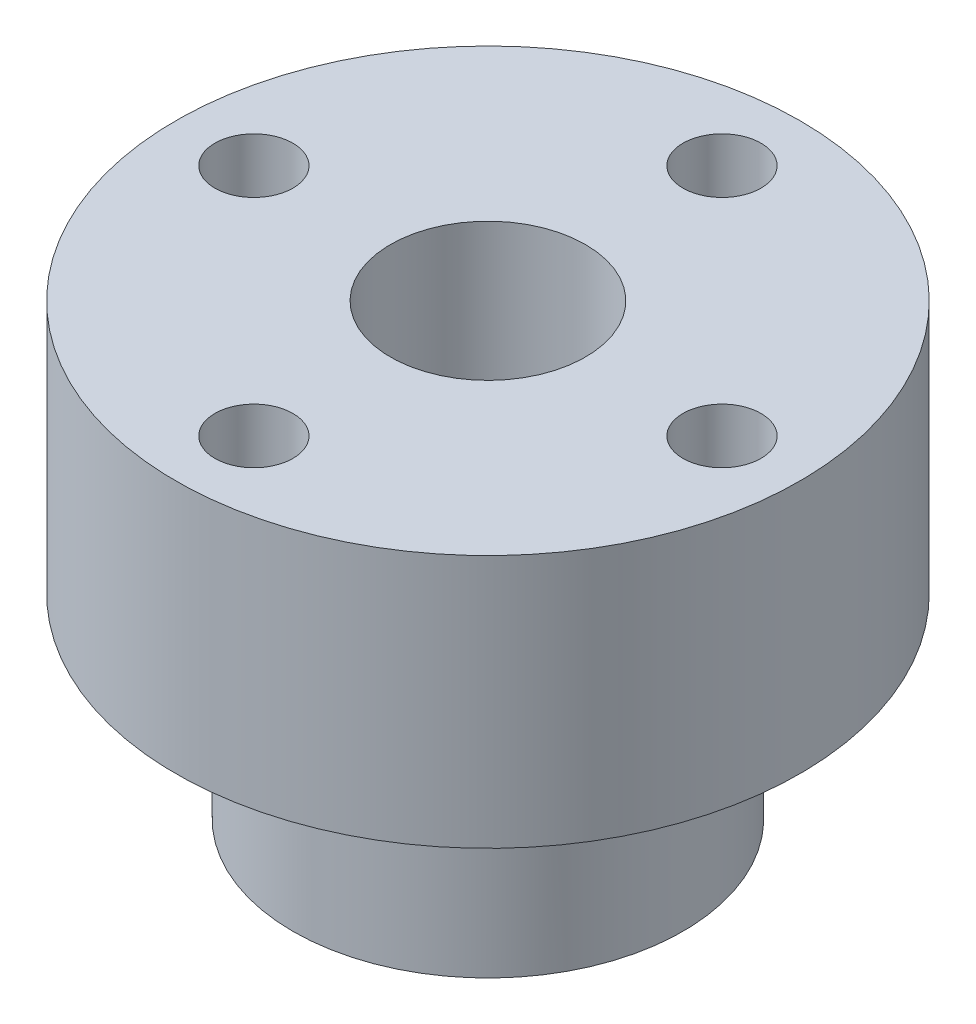
ISO-10303-21;
HEADER;
FILE_DESCRIPTION(('STEP AP214'),'2;1');
FILE_NAME('part.step','',(''),(''),'','','');
FILE_SCHEMA(('AUTOMOTIVE_DESIGN { 1 0 10303 214 1 1 1 1 }'));
ENDSEC;
DATA;
#1=APPLICATION_CONTEXT('core data for automotive mechanical design processes');
#2=APPLICATION_PROTOCOL_DEFINITION('international standard','automotive_design',2000,#1);
#3=PRODUCT_CONTEXT('',#1,'mechanical');
#4=PRODUCT('Part','Part','',(#3));
#5=PRODUCT_RELATED_PRODUCT_CATEGORY('part','',(#4));
#6=PRODUCT_DEFINITION_FORMATION('','',#4);
#7=PRODUCT_DEFINITION_CONTEXT('part definition',#1,'design');
#8=PRODUCT_DEFINITION('design','',#6,#7);
#9=PRODUCT_DEFINITION_SHAPE('','',#8);
#10=(LENGTH_UNIT() NAMED_UNIT(*) SI_UNIT(.MILLI.,.METRE.));
#11=(NAMED_UNIT(*) PLANE_ANGLE_UNIT() SI_UNIT($,.RADIAN.));
#12=(NAMED_UNIT(*) SI_UNIT($,.STERADIAN.) SOLID_ANGLE_UNIT());
#13=UNCERTAINTY_MEASURE_WITH_UNIT(LENGTH_MEASURE(1.E-05),#10,'distance_accuracy_value','');
#14=(GEOMETRIC_REPRESENTATION_CONTEXT(3) GLOBAL_UNCERTAINTY_ASSIGNED_CONTEXT((#13)) GLOBAL_UNIT_ASSIGNED_CONTEXT((#10,
#11,#12)) REPRESENTATION_CONTEXT('',''));
#15=CARTESIAN_POINT('',(0.,0.,0.));
#16=DIRECTION('',(0.,0.,1.));
#17=DIRECTION('',(1.,0.,0.));
#18=AXIS2_PLACEMENT_3D('',#15,#16,#17);
#19=CARTESIAN_POINT('',(0.,13.,0.));
#20=DIRECTION('',(0.,-1.,0.));
#21=DIRECTION('',(0.,0.,-1.));
#22=AXIS2_PLACEMENT_3D('',#19,#20,#21);
#23=CYLINDRICAL_SURFACE('',#22,16.);
#24=CARTESIAN_POINT('',(0.,13.,0.));
#25=DIRECTION('',(0.,1.,0.));
#26=DIRECTION('',(0.,0.,1.));
#27=AXIS2_PLACEMENT_3D('',#24,#25,#26);
#28=CIRCLE('',#27,16.);
#29=CARTESIAN_POINT('',(0.,13.,-16.));
#30=VERTEX_POINT('',#29);
#31=EDGE_CURVE('E87',#30,#30,#28,.T.);
#32=CARTESIAN_POINT('',(0.,0.,0.));
#33=DIRECTION('',(0.,1.,0.));
#34=DIRECTION('',(0.,0.,1.));
#35=AXIS2_PLACEMENT_3D('',#32,#33,#34);
#36=CIRCLE('',#35,16.);
#37=CARTESIAN_POINT('',(0.,0.,-16.));
#38=VERTEX_POINT('',#37);
#39=EDGE_CURVE('E45',#38,#38,#36,.T.);
#40=CARTESIAN_POINT('',(0.,13.,-16.));
#41=CARTESIAN_POINT('',(0.,12.8645833333333,-16.));
#42=CARTESIAN_POINT('',(0.,12.7291666666667,-16.));
#43=CARTESIAN_POINT('',(0.,12.4583333333333,-16.));
#44=CARTESIAN_POINT('',(0.,12.3229166666667,-16.));
#45=CARTESIAN_POINT('',(0.,12.0520833333333,-16.));
#46=CARTESIAN_POINT('',(0.,11.9166666666667,-16.));
#47=CARTESIAN_POINT('',(0.,11.6458333333333,-16.));
#48=CARTESIAN_POINT('',(0.,11.5104166666667,-16.));
#49=CARTESIAN_POINT('',(0.,11.2395833333333,-16.));
#50=CARTESIAN_POINT('',(0.,11.1041666666667,-16.));
#51=CARTESIAN_POINT('',(0.,10.8333333333333,-16.));
#52=CARTESIAN_POINT('',(0.,10.6979166666667,-16.));
#53=CARTESIAN_POINT('',(0.,10.4270833333333,-16.));
#54=CARTESIAN_POINT('',(0.,10.2916666666667,-16.));
#55=CARTESIAN_POINT('',(0.,10.0208333333333,-16.));
#56=CARTESIAN_POINT('',(0.,9.88541666666667,-16.));
#57=CARTESIAN_POINT('',(0.,9.61458333333333,-16.));
#58=CARTESIAN_POINT('',(0.,9.47916666666667,-16.));
#59=CARTESIAN_POINT('',(0.,9.20833333333333,-16.));
#60=CARTESIAN_POINT('',(0.,9.07291666666667,-16.));
#61=CARTESIAN_POINT('',(0.,8.80208333333333,-16.));
#62=CARTESIAN_POINT('',(0.,8.66666666666667,-16.));
#63=CARTESIAN_POINT('',(0.,8.39583333333333,-16.));
#64=CARTESIAN_POINT('',(0.,8.26041666666667,-16.));
#65=CARTESIAN_POINT('',(0.,7.98958333333333,-16.));
#66=CARTESIAN_POINT('',(0.,7.85416666666667,-16.));
#67=CARTESIAN_POINT('',(0.,7.58333333333333,-16.));
#68=CARTESIAN_POINT('',(0.,7.44791666666667,-16.));
#69=CARTESIAN_POINT('',(0.,7.17708333333333,-16.));
#70=CARTESIAN_POINT('',(0.,7.04166666666667,-16.));
#71=CARTESIAN_POINT('',(0.,6.77083333333333,-16.));
#72=CARTESIAN_POINT('',(0.,6.63541666666667,-16.));
#73=CARTESIAN_POINT('',(0.,6.36458333333333,-16.));
#74=CARTESIAN_POINT('',(0.,6.22916666666667,-16.));
#75=CARTESIAN_POINT('',(0.,5.95833333333333,-16.));
#76=CARTESIAN_POINT('',(0.,5.82291666666667,-16.));
#77=CARTESIAN_POINT('',(0.,5.55208333333333,-16.));
#78=CARTESIAN_POINT('',(0.,5.41666666666667,-16.));
#79=CARTESIAN_POINT('',(0.,5.14583333333333,-16.));
#80=CARTESIAN_POINT('',(0.,5.01041666666667,-16.));
#81=CARTESIAN_POINT('',(0.,4.73958333333333,-16.));
#82=CARTESIAN_POINT('',(0.,4.60416666666667,-16.));
#83=CARTESIAN_POINT('',(0.,4.33333333333333,-16.));
#84=CARTESIAN_POINT('',(0.,4.19791666666667,-16.));
#85=CARTESIAN_POINT('',(0.,3.92708333333333,-16.));
#86=CARTESIAN_POINT('',(0.,3.79166666666667,-16.));
#87=CARTESIAN_POINT('',(0.,3.52083333333333,-16.));
#88=CARTESIAN_POINT('',(0.,3.38541666666667,-16.));
#89=CARTESIAN_POINT('',(0.,3.11458333333333,-16.));
#90=CARTESIAN_POINT('',(0.,2.97916666666667,-16.));
#91=CARTESIAN_POINT('',(0.,2.70833333333333,-16.));
#92=CARTESIAN_POINT('',(0.,2.57291666666667,-16.));
#93=CARTESIAN_POINT('',(0.,2.30208333333333,-16.));
#94=CARTESIAN_POINT('',(0.,2.16666666666667,-16.));
#95=CARTESIAN_POINT('',(0.,1.89583333333333,-16.));
#96=CARTESIAN_POINT('',(0.,1.76041666666667,-16.));
#97=CARTESIAN_POINT('',(0.,1.48958333333333,-16.));
#98=CARTESIAN_POINT('',(0.,1.35416666666667,-16.));
#99=CARTESIAN_POINT('',(0.,1.08333333333333,-16.));
#100=CARTESIAN_POINT('',(0.,0.947916666666667,-16.));
#101=CARTESIAN_POINT('',(0.,0.677083333333334,-16.));
#102=CARTESIAN_POINT('',(0.,0.541666666666667,-16.));
#103=CARTESIAN_POINT('',(0.,0.270833333333334,-16.));
#104=CARTESIAN_POINT('',(0.,0.135416666666667,-16.));
#105=CARTESIAN_POINT('',(0.,0.,-16.));
#106=B_SPLINE_CURVE_WITH_KNOTS('',3,(#40,#41,#42,#43,#44,#45,#46,#47,#48,#49,#50,#51,#52,#53,
#54,#55,#56,#57,#58,#59,#60,#61,#62,#63,#64,#65,#66,#67,#68,#69,#70,#71,#72,#73,#74,#75,#76,#77,
#78,#79,#80,#81,#82,#83,#84,#85,#86,#87,#88,#89,#90,#91,#92,#93,#94,#95,#96,#97,#98,#99,#100,
#101,#102,#103,#104,#105),.UNSPECIFIED.,.F.,.F.,(4,2,2,2,2,2,2,2,2,2,2,2,2,2,2,2,2,2,2,2,2,2,2,
2,2,2,2,2,2,2,2,2,4),(0.,0.406249999999999,0.812499999999999,1.21875,1.625,2.03125,2.4375,
2.84375,3.25,3.65625,4.0625,4.46875,4.875,5.28125,5.6875,6.09375,6.5,6.90625,7.3125,7.71875,
8.125,8.53125,8.9375,9.34375,9.75,10.15625,10.5625,10.96875,11.375,11.78125,12.1875,12.59375,
13.),.UNSPECIFIED.);
#107=EDGE_CURVE('BSEAM41',#30,#38,#106,.T.);
#108=ORIENTED_EDGE('',*,*,#31,.F.);
#109=ORIENTED_EDGE('',*,*,#39,.T.);
#110=ORIENTED_EDGE('',*,*,#107,.T.);
#111=ORIENTED_EDGE('',*,*,#107,.F.);
#112=EDGE_LOOP('',(#108,#110,#109,#111));
#113=FACE_BOUND('',#112,.T.);
#114=ADVANCED_FACE('F41',(#113),#23,.T.);
#115=CARTESIAN_POINT('',(0.,13.,-12.));
#116=DIRECTION('',(0.,-1.,0.));
#117=DIRECTION('',(0.,0.,-1.));
#118=AXIS2_PLACEMENT_3D('',#115,#116,#117);
#119=CYLINDRICAL_SURFACE('',#118,2.);
#120=CARTESIAN_POINT('',(0.,13.,-12.));
#121=DIRECTION('',(0.,1.,0.));
#122=DIRECTION('',(0.,0.,1.));
#123=AXIS2_PLACEMENT_3D('',#120,#121,#122);
#124=CIRCLE('',#123,2.);
#125=CARTESIAN_POINT('',(0.,13.,-10.));
#126=VERTEX_POINT('',#125);
#127=EDGE_CURVE('E92',#126,#126,#124,.T.);
#128=ORIENTED_EDGE('',*,*,#127,.T.);
#129=EDGE_LOOP('',(#128));
#130=FACE_BOUND('',#129,.T.);
#131=CARTESIAN_POINT('',(0.,0.,-12.));
#132=DIRECTION('',(0.,1.,0.));
#133=DIRECTION('',(0.,0.,1.));
#134=AXIS2_PLACEMENT_3D('',#131,#132,#133);
#135=CIRCLE('',#134,2.);
#136=CARTESIAN_POINT('',(0.,0.,-10.));
#137=VERTEX_POINT('',#136);
#138=EDGE_CURVE('E99',#137,#137,#135,.T.);
#139=ORIENTED_EDGE('',*,*,#138,.F.);
#140=EDGE_LOOP('',(#139));
#141=FACE_BOUND('',#140,.T.);
#142=ADVANCED_FACE('F117',(#130,#141),#119,.F.);
#143=CARTESIAN_POINT('',(-12.,13.,0.));
#144=DIRECTION('',(0.,-1.,0.));
#145=DIRECTION('',(0.,0.,-1.));
#146=AXIS2_PLACEMENT_3D('',#143,#144,#145);
#147=CYLINDRICAL_SURFACE('',#146,2.);
#148=CARTESIAN_POINT('',(-12.,13.,0.));
#149=DIRECTION('',(0.,1.,0.));
#150=DIRECTION('',(0.,0.,1.));
#151=AXIS2_PLACEMENT_3D('',#148,#149,#150);
#152=CIRCLE('',#151,2.);
#153=CARTESIAN_POINT('',(-12.,13.,2.));
#154=VERTEX_POINT('',#153);
#155=EDGE_CURVE('E110',#154,#154,#152,.T.);
#156=ORIENTED_EDGE('',*,*,#155,.T.);
#157=EDGE_LOOP('',(#156));
#158=FACE_BOUND('',#157,.T.);
#159=CARTESIAN_POINT('',(-12.,0.,0.));
#160=DIRECTION('',(0.,1.,0.));
#161=DIRECTION('',(0.,0.,1.));
#162=AXIS2_PLACEMENT_3D('',#159,#160,#161);
#163=CIRCLE('',#162,2.);
#164=CARTESIAN_POINT('',(-10.,0.,0.));
#165=VERTEX_POINT('',#164);
#166=EDGE_CURVE('E98',#165,#165,#163,.T.);
#167=ORIENTED_EDGE('',*,*,#166,.F.);
#168=EDGE_LOOP('',(#167));
#169=FACE_BOUND('',#168,.T.);
#170=ADVANCED_FACE('F134',(#158,#169),#147,.F.);
#171=CARTESIAN_POINT('',(0.,13.,12.));
#172=DIRECTION('',(0.,-1.,0.));
#173=DIRECTION('',(0.,0.,-1.));
#174=AXIS2_PLACEMENT_3D('',#171,#172,#173);
#175=CYLINDRICAL_SURFACE('',#174,2.);
#176=CARTESIAN_POINT('',(0.,13.,12.));
#177=DIRECTION('',(0.,1.,0.));
#178=DIRECTION('',(0.,0.,1.));
#179=AXIS2_PLACEMENT_3D('',#176,#177,#178);
#180=CIRCLE('',#179,2.);
#181=CARTESIAN_POINT('',(0.,13.,14.));
#182=VERTEX_POINT('',#181);
#183=EDGE_CURVE('E106',#182,#182,#180,.T.);
#184=ORIENTED_EDGE('',*,*,#183,.T.);
#185=EDGE_LOOP('',(#184));
#186=FACE_BOUND('',#185,.T.);
#187=CARTESIAN_POINT('',(0.,0.,12.));
#188=DIRECTION('',(0.,1.,0.));
#189=DIRECTION('',(0.,0.,1.));
#190=AXIS2_PLACEMENT_3D('',#187,#188,#189);
#191=CIRCLE('',#190,2.);
#192=CARTESIAN_POINT('',(0.,0.,10.));
#193=VERTEX_POINT('',#192);
#194=EDGE_CURVE('E77',#193,#193,#191,.T.);
#195=ORIENTED_EDGE('',*,*,#194,.F.);
#196=EDGE_LOOP('',(#195));
#197=FACE_BOUND('',#196,.T.);
#198=ADVANCED_FACE('F140',(#186,#197),#175,.F.);
#199=CARTESIAN_POINT('',(12.,13.,0.));
#200=DIRECTION('',(0.,-1.,0.));
#201=DIRECTION('',(0.,0.,-1.));
#202=AXIS2_PLACEMENT_3D('',#199,#200,#201);
#203=CYLINDRICAL_SURFACE('',#202,2.);
#204=CARTESIAN_POINT('',(12.,13.,0.));
#205=DIRECTION('',(0.,1.,0.));
#206=DIRECTION('',(0.,0.,1.));
#207=AXIS2_PLACEMENT_3D('',#204,#205,#206);
#208=CIRCLE('',#207,2.);
#209=CARTESIAN_POINT('',(12.,13.,2.));
#210=VERTEX_POINT('',#209);
#211=EDGE_CURVE('E102',#210,#210,#208,.T.);
#212=ORIENTED_EDGE('',*,*,#211,.T.);
#213=EDGE_LOOP('',(#212));
#214=FACE_BOUND('',#213,.T.);
#215=CARTESIAN_POINT('',(12.,0.,0.));
#216=DIRECTION('',(0.,1.,0.));
#217=DIRECTION('',(0.,0.,1.));
#218=AXIS2_PLACEMENT_3D('',#215,#216,#217);
#219=CIRCLE('',#218,2.);
#220=CARTESIAN_POINT('',(10.,0.,0.));
#221=VERTEX_POINT('',#220);
#222=EDGE_CURVE('E75',#221,#221,#219,.T.);
#223=ORIENTED_EDGE('',*,*,#222,.F.);
#224=EDGE_LOOP('',(#223));
#225=FACE_BOUND('',#224,.T.);
#226=ADVANCED_FACE('F43',(#214,#225),#203,.F.);
#227=CARTESIAN_POINT('',(0.,13.,0.));
#228=DIRECTION('',(0.,-1.,0.));
#229=DIRECTION('',(0.,0.,-1.));
#230=AXIS2_PLACEMENT_3D('',#227,#228,#229);
#231=CYLINDRICAL_SURFACE('',#230,5.);
#232=CARTESIAN_POINT('',(0.,13.,0.));
#233=DIRECTION('',(0.,1.,0.));
#234=DIRECTION('',(0.,0.,1.));
#235=AXIS2_PLACEMENT_3D('',#232,#233,#234);
#236=CIRCLE('',#235,5.);
#237=CARTESIAN_POINT('',(0.,13.,-5.));
#238=VERTEX_POINT('',#237);
#239=EDGE_CURVE('E84',#238,#238,#236,.T.);
#240=CARTESIAN_POINT('',(0.,-10.,0.));
#241=DIRECTION('',(0.,1.,0.));
#242=DIRECTION('',(0.,0.,1.));
#243=AXIS2_PLACEMENT_3D('',#240,#241,#242);
#244=CIRCLE('',#243,5.);
#245=CARTESIAN_POINT('',(0.,-10.,-5.));
#246=VERTEX_POINT('',#245);
#247=EDGE_CURVE('E78',#246,#246,#244,.T.);
#248=CARTESIAN_POINT('',(0.,13.,-5.));
#249=CARTESIAN_POINT('',(0.,12.7604166666667,-5.));
#250=CARTESIAN_POINT('',(0.,12.5208333333333,-5.));
#251=CARTESIAN_POINT('',(0.,12.0416666666667,-5.));
#252=CARTESIAN_POINT('',(0.,11.8020833333333,-5.));
#253=CARTESIAN_POINT('',(0.,11.3229166666667,-5.));
#254=CARTESIAN_POINT('',(0.,11.0833333333333,-5.));
#255=CARTESIAN_POINT('',(0.,10.6041666666667,-5.));
#256=CARTESIAN_POINT('',(0.,10.3645833333333,-5.));
#257=CARTESIAN_POINT('',(0.,9.88541666666667,-5.));
#258=CARTESIAN_POINT('',(0.,9.64583333333333,-5.));
#259=CARTESIAN_POINT('',(0.,9.16666666666666,-5.));
#260=CARTESIAN_POINT('',(0.,8.92708333333333,-5.));
#261=CARTESIAN_POINT('',(0.,8.44791666666666,-5.));
#262=CARTESIAN_POINT('',(0.,8.20833333333333,-5.));
#263=CARTESIAN_POINT('',(0.,7.72916666666666,-5.));
#264=CARTESIAN_POINT('',(0.,7.48958333333333,-5.));
#265=CARTESIAN_POINT('',(0.,7.01041666666666,-5.));
#266=CARTESIAN_POINT('',(0.,6.77083333333333,-5.));
#267=CARTESIAN_POINT('',(0.,6.29166666666666,-5.));
#268=CARTESIAN_POINT('',(0.,6.05208333333333,-5.));
#269=CARTESIAN_POINT('',(0.,5.57291666666666,-5.));
#270=CARTESIAN_POINT('',(0.,5.33333333333333,-5.));
#271=CARTESIAN_POINT('',(0.,4.85416666666667,-5.));
#272=CARTESIAN_POINT('',(0.,4.61458333333333,-5.));
#273=CARTESIAN_POINT('',(0.,4.13541666666667,-5.));
#274=CARTESIAN_POINT('',(0.,3.89583333333333,-5.));
#275=CARTESIAN_POINT('',(0.,3.41666666666667,-5.));
#276=CARTESIAN_POINT('',(0.,3.17708333333333,-5.));
#277=CARTESIAN_POINT('',(0.,2.69791666666667,-5.));
#278=CARTESIAN_POINT('',(0.,2.45833333333333,-5.));
#279=CARTESIAN_POINT('',(0.,1.97916666666667,-5.));
#280=CARTESIAN_POINT('',(0.,1.73958333333333,-5.));
#281=CARTESIAN_POINT('',(0.,1.26041666666666,-5.));
#282=CARTESIAN_POINT('',(0.,1.02083333333333,-5.));
#283=CARTESIAN_POINT('',(0.,0.541666666666664,-5.));
#284=CARTESIAN_POINT('',(0.,0.30208333333333,-5.));
#285=CARTESIAN_POINT('',(0.,-0.177083333333336,-5.));
#286=CARTESIAN_POINT('',(0.,-0.416666666666669,-5.));
#287=CARTESIAN_POINT('',(0.,-0.895833333333336,-5.));
#288=CARTESIAN_POINT('',(0.,-1.13541666666667,-5.));
#289=CARTESIAN_POINT('',(0.,-1.61458333333334,-5.));
#290=CARTESIAN_POINT('',(0.,-1.85416666666667,-5.));
#291=CARTESIAN_POINT('',(0.,-2.33333333333334,-5.));
#292=CARTESIAN_POINT('',(0.,-2.57291666666667,-5.));
#293=CARTESIAN_POINT('',(0.,-3.05208333333333,-5.));
#294=CARTESIAN_POINT('',(0.,-3.29166666666667,-5.));
#295=CARTESIAN_POINT('',(0.,-3.77083333333333,-5.));
#296=CARTESIAN_POINT('',(0.,-4.01041666666667,-5.));
#297=CARTESIAN_POINT('',(0.,-4.48958333333334,-5.));
#298=CARTESIAN_POINT('',(0.,-4.72916666666667,-5.));
#299=CARTESIAN_POINT('',(0.,-5.20833333333334,-5.));
#300=CARTESIAN_POINT('',(0.,-5.44791666666667,-5.));
#301=CARTESIAN_POINT('',(0.,-5.92708333333334,-5.));
#302=CARTESIAN_POINT('',(0.,-6.16666666666667,-5.));
#303=CARTESIAN_POINT('',(0.,-6.64583333333334,-5.));
#304=CARTESIAN_POINT('',(0.,-6.88541666666667,-5.));
#305=CARTESIAN_POINT('',(0.,-7.36458333333333,-5.));
#306=CARTESIAN_POINT('',(0.,-7.60416666666667,-5.));
#307=CARTESIAN_POINT('',(0.,-8.08333333333333,-5.));
#308=CARTESIAN_POINT('',(0.,-8.32291666666667,-5.));
#309=CARTESIAN_POINT('',(0.,-8.80208333333334,-5.));
#310=CARTESIAN_POINT('',(0.,-9.04166666666667,-5.));
#311=CARTESIAN_POINT('',(0.,-9.52083333333334,-5.));
#312=CARTESIAN_POINT('',(0.,-9.76041666666667,-5.));
#313=CARTESIAN_POINT('',(0.,-10.,-5.));
#314=B_SPLINE_CURVE_WITH_KNOTS('',3,(#248,#249,#250,#251,#252,#253,#254,#255,#256,#257,#258,
#259,#260,#261,#262,#263,#264,#265,#266,#267,#268,#269,#270,#271,#272,#273,#274,#275,#276,#277,
#278,#279,#280,#281,#282,#283,#284,#285,#286,#287,#288,#289,#290,#291,#292,#293,#294,#295,#296,
#297,#298,#299,#300,#301,#302,#303,#304,#305,#306,#307,#308,#309,#310,#311,#312,#313),
.UNSPECIFIED.,.F.,.F.,(4,2,2,2,2,2,2,2,2,2,2,2,2,2,2,2,2,2,2,2,2,2,2,2,2,2,2,2,2,2,2,2,4),(0.,
0.718750000000001,1.4375,2.15625,2.875,3.59375,4.3125,5.03125,5.75,6.46875,7.1875,7.90625,8.625,
9.34375,10.0625,10.78125,11.5,12.21875,12.9375,13.65625,14.375,15.09375,15.8125,16.53125,17.25,
17.96875,18.6875,19.40625,20.125,20.84375,21.5625,22.28125,23.),.UNSPECIFIED.);
#315=EDGE_CURVE('BSEAM123',#238,#246,#314,.T.);
#316=ORIENTED_EDGE('',*,*,#239,.T.);
#317=ORIENTED_EDGE('',*,*,#247,.F.);
#318=ORIENTED_EDGE('',*,*,#315,.T.);
#319=ORIENTED_EDGE('',*,*,#315,.F.);
#320=EDGE_LOOP('',(#316,#318,#317,#319));
#321=FACE_BOUND('',#320,.T.);
#322=ADVANCED_FACE('F123',(#321),#231,.F.);
#323=CARTESIAN_POINT('',(0.,13.,0.));
#324=DIRECTION('',(0.,1.,0.));
#325=DIRECTION('',(0.,0.,1.));
#326=AXIS2_PLACEMENT_3D('',#323,#324,#325);
#327=PLANE('',#326);
#328=ORIENTED_EDGE('',*,*,#211,.F.);
#329=EDGE_LOOP('',(#328));
#330=FACE_BOUND('',#329,.T.);
#331=ORIENTED_EDGE('',*,*,#183,.F.);
#332=EDGE_LOOP('',(#331));
#333=FACE_BOUND('',#332,.T.);
#334=ORIENTED_EDGE('',*,*,#155,.F.);
#335=EDGE_LOOP('',(#334));
#336=FACE_BOUND('',#335,.T.);
#337=ORIENTED_EDGE('',*,*,#127,.F.);
#338=EDGE_LOOP('',(#337));
#339=FACE_BOUND('',#338,.T.);
#340=ORIENTED_EDGE('',*,*,#31,.T.);
#341=EDGE_LOOP('',(#340));
#342=FACE_BOUND('',#341,.T.);
#343=ORIENTED_EDGE('',*,*,#239,.F.);
#344=EDGE_LOOP('',(#343));
#345=FACE_BOUND('',#344,.T.);
#346=ADVANCED_FACE('F120',(#330,#333,#336,#339,#342,#345),#327,.T.);
#347=CARTESIAN_POINT('',(0.,0.,0.));
#348=DIRECTION('',(0.,1.,0.));
#349=DIRECTION('',(0.,0.,1.));
#350=AXIS2_PLACEMENT_3D('',#347,#348,#349);
#351=PLANE('',#350);
#352=ORIENTED_EDGE('',*,*,#194,.T.);
#353=CARTESIAN_POINT('',(0.,0.,0.));
#354=DIRECTION('',(0.,1.,0.));
#355=DIRECTION('',(0.,0.,1.));
#356=AXIS2_PLACEMENT_3D('',#353,#354,#355);
#357=CIRCLE('',#356,10.);
#358=EDGE_CURVE('E52',#193,#221,#357,.T.);
#359=ORIENTED_EDGE('',*,*,#358,.T.);
#360=ORIENTED_EDGE('',*,*,#222,.T.);
#361=EDGE_CURVE('E11',#221,#137,#357,.T.);
#362=ORIENTED_EDGE('',*,*,#361,.T.);
#363=ORIENTED_EDGE('',*,*,#138,.T.);
#364=EDGE_CURVE('E50',#137,#165,#357,.T.);
#365=ORIENTED_EDGE('',*,*,#364,.T.);
#366=ORIENTED_EDGE('',*,*,#166,.T.);
#367=EDGE_CURVE('E62',#165,#193,#357,.T.);
#368=ORIENTED_EDGE('',*,*,#367,.T.);
#369=EDGE_LOOP('',(#352,#359,#360,#362,#363,#365,#366,#368));
#370=FACE_BOUND('',#369,.T.);
#371=ORIENTED_EDGE('',*,*,#39,.F.);
#372=EDGE_LOOP('',(#371));
#373=FACE_BOUND('',#372,.T.);
#374=ADVANCED_FACE('F72',(#370,#373),#351,.F.);
#375=CARTESIAN_POINT('',(0.,-10.,0.));
#376=DIRECTION('',(0.,1.,0.));
#377=DIRECTION('',(0.,0.,1.));
#378=AXIS2_PLACEMENT_3D('',#375,#376,#377);
#379=CYLINDRICAL_SURFACE('',#378,10.);
#380=CARTESIAN_POINT('',(0.,-10.,0.));
#381=DIRECTION('',(0.,1.,0.));
#382=DIRECTION('',(0.,0.,1.));
#383=AXIS2_PLACEMENT_3D('',#380,#381,#382);
#384=CIRCLE('',#383,10.);
#385=CARTESIAN_POINT('',(0.,-10.,10.));
#386=VERTEX_POINT('',#385);
#387=EDGE_CURVE('E80',#386,#386,#384,.T.);
#388=ORIENTED_EDGE('',*,*,#387,.T.);
#389=EDGE_LOOP('',(#388));
#390=FACE_BOUND('',#389,.T.);
#391=ORIENTED_EDGE('',*,*,#358,.F.);
#392=ORIENTED_EDGE('',*,*,#367,.F.);
#393=ORIENTED_EDGE('',*,*,#364,.F.);
#394=ORIENTED_EDGE('',*,*,#361,.F.);
#395=EDGE_LOOP('',(#391,#392,#393,#394));
#396=FACE_BOUND('',#395,.T.);
#397=ADVANCED_FACE('F67',(#390,#396),#379,.T.);
#398=CARTESIAN_POINT('',(0.,-10.,0.));
#399=DIRECTION('',(0.,1.,0.));
#400=DIRECTION('',(0.,0.,1.));
#401=AXIS2_PLACEMENT_3D('',#398,#399,#400);
#402=PLANE('',#401);
#403=ORIENTED_EDGE('',*,*,#247,.T.);
#404=EDGE_LOOP('',(#403));
#405=FACE_BOUND('',#404,.T.);
#406=ORIENTED_EDGE('',*,*,#387,.F.);
#407=EDGE_LOOP('',(#406));
#408=FACE_BOUND('',#407,.T.);
#409=ADVANCED_FACE('F164',(#405,#408),#402,.F.);
#410=CLOSED_SHELL('',(#114,#142,#170,#198,#226,#322,#346,#374,#397,#409));
#411=MANIFOLD_SOLID_BREP('B2',#410);
#412=ADVANCED_BREP_SHAPE_REPRESENTATION('',(#18,#411),#14);
#413=SHAPE_DEFINITION_REPRESENTATION(#9,#412);
ENDSEC;
END-ISO-10303-21;
